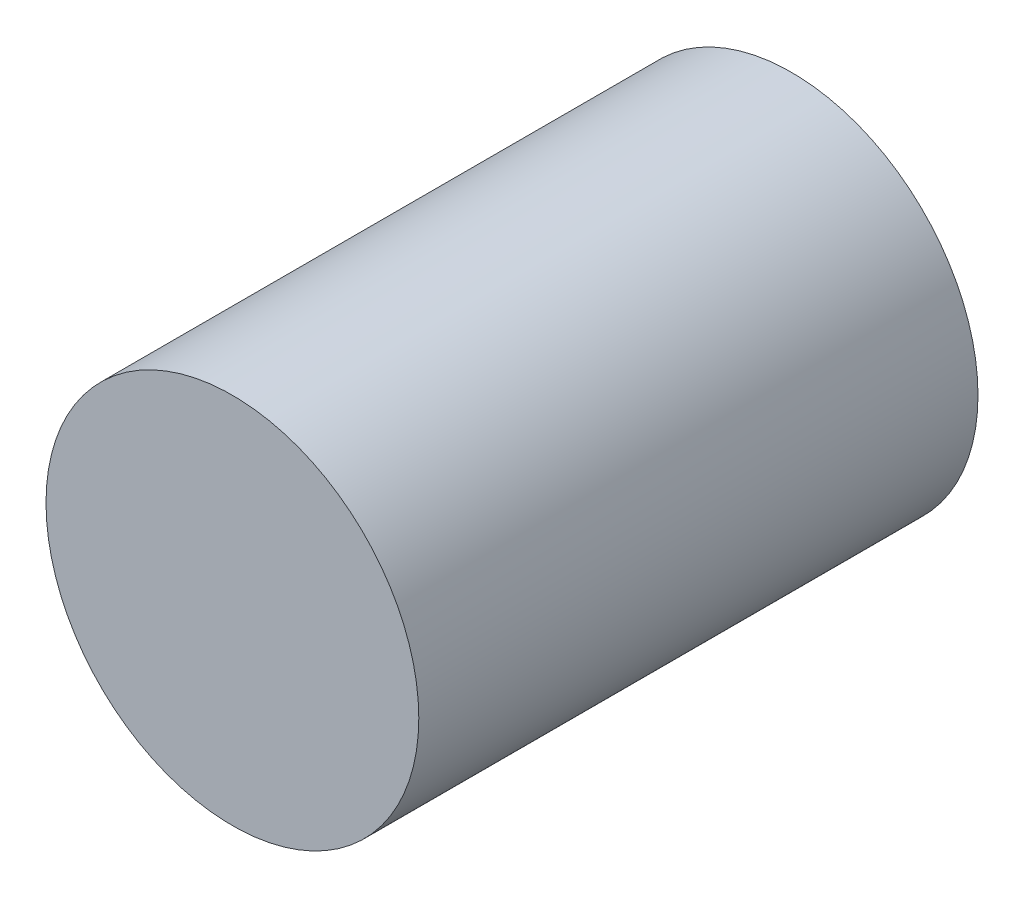
ISO-10303-21;
HEADER;
FILE_DESCRIPTION(('STEP AP214'),'2;1');
FILE_NAME('part.step','',(''),(''),'','','');
FILE_SCHEMA(('AUTOMOTIVE_DESIGN { 1 0 10303 214 1 1 1 1 }'));
ENDSEC;
DATA;
#1=APPLICATION_CONTEXT('core data for automotive mechanical design processes');
#2=APPLICATION_PROTOCOL_DEFINITION('international standard','automotive_design',2000,#1);
#3=PRODUCT_CONTEXT('',#1,'mechanical');
#4=PRODUCT('Part','Part','',(#3));
#5=PRODUCT_RELATED_PRODUCT_CATEGORY('part','',(#4));
#6=PRODUCT_DEFINITION_FORMATION('','',#4);
#7=PRODUCT_DEFINITION_CONTEXT('part definition',#1,'design');
#8=PRODUCT_DEFINITION('design','',#6,#7);
#9=PRODUCT_DEFINITION_SHAPE('','',#8);
#10=(LENGTH_UNIT() NAMED_UNIT(*) SI_UNIT(.MILLI.,.METRE.));
#11=(NAMED_UNIT(*) PLANE_ANGLE_UNIT() SI_UNIT($,.RADIAN.));
#12=(NAMED_UNIT(*) SI_UNIT($,.STERADIAN.) SOLID_ANGLE_UNIT());
#13=UNCERTAINTY_MEASURE_WITH_UNIT(LENGTH_MEASURE(1.E-05),#10,'distance_accuracy_value','');
#14=(GEOMETRIC_REPRESENTATION_CONTEXT(3) GLOBAL_UNCERTAINTY_ASSIGNED_CONTEXT((#13)) GLOBAL_UNIT_ASSIGNED_CONTEXT((#10,
#11,#12)) REPRESENTATION_CONTEXT('',''));
#15=CARTESIAN_POINT('',(0.,0.,0.));
#16=DIRECTION('',(0.,0.,1.));
#17=DIRECTION('',(1.,0.,0.));
#18=AXIS2_PLACEMENT_3D('',#15,#16,#17);
#19=CARTESIAN_POINT('',(0.,0.,15.));
#20=DIRECTION('',(0.,0.,-1.));
#21=DIRECTION('',(-1.,0.,0.));
#22=AXIS2_PLACEMENT_3D('',#19,#20,#21);
#23=CYLINDRICAL_SURFACE('',#22,10.);
#24=CARTESIAN_POINT('',(0.,0.,15.));
#25=DIRECTION('',(0.,0.,1.));
#26=DIRECTION('',(1.,0.,0.));
#27=AXIS2_PLACEMENT_3D('',#24,#25,#26);
#28=CIRCLE('',#27,10.);
#29=CARTESIAN_POINT('',(10.,0.,15.));
#30=VERTEX_POINT('',#29);
#31=EDGE_CURVE('E10',#30,#30,#28,.T.);
#32=ORIENTED_EDGE('',*,*,#31,.F.);
#33=EDGE_LOOP('',(#32));
#34=FACE_BOUND('',#33,.T.);
#35=CARTESIAN_POINT('',(0.,0.,-15.));
#36=DIRECTION('',(0.,0.,1.));
#37=DIRECTION('',(1.,0.,0.));
#38=AXIS2_PLACEMENT_3D('',#35,#36,#37);
#39=CIRCLE('',#38,10.);
#40=CARTESIAN_POINT('',(10.,0.,-15.));
#41=VERTEX_POINT('',#40);
#42=EDGE_CURVE('E34',#41,#41,#39,.T.);
#43=ORIENTED_EDGE('',*,*,#42,.T.);
#44=EDGE_LOOP('',(#43));
#45=FACE_BOUND('',#44,.T.);
#46=ADVANCED_FACE('F31',(#34,#45),#23,.T.);
#47=CARTESIAN_POINT('',(0.,0.,15.));
#48=DIRECTION('',(0.,0.,1.));
#49=DIRECTION('',(1.,0.,0.));
#50=AXIS2_PLACEMENT_3D('',#47,#48,#49);
#51=PLANE('',#50);
#52=ORIENTED_EDGE('',*,*,#31,.T.);
#53=EDGE_LOOP('',(#52));
#54=FACE_BOUND('',#53,.T.);
#55=ADVANCED_FACE('F46',(#54),#51,.T.);
#56=CARTESIAN_POINT('',(0.,0.,-15.));
#57=DIRECTION('',(0.,0.,1.));
#58=DIRECTION('',(1.,0.,0.));
#59=AXIS2_PLACEMENT_3D('',#56,#57,#58);
#60=PLANE('',#59);
#61=ORIENTED_EDGE('',*,*,#42,.F.);
#62=EDGE_LOOP('',(#61));
#63=FACE_BOUND('',#62,.T.);
#64=ADVANCED_FACE('F44',(#63),#60,.F.);
#65=CLOSED_SHELL('',(#46,#55,#64));
#66=MANIFOLD_SOLID_BREP('B2',#65);
#67=ADVANCED_BREP_SHAPE_REPRESENTATION('',(#18,#66),#14);
#68=SHAPE_DEFINITION_REPRESENTATION(#9,#67);
ENDSEC;
END-ISO-10303-21;
